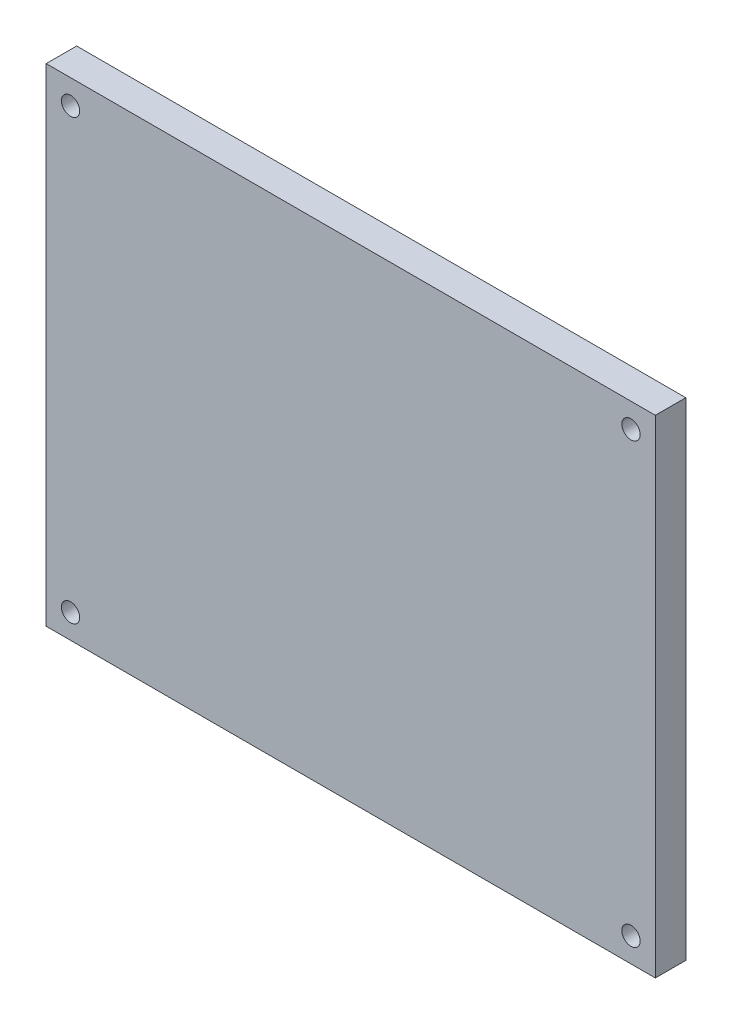
ISO-10303-21;
HEADER;
FILE_DESCRIPTION(('STEP AP214'),'2;1');
FILE_NAME('part.step','',(''),(''),'','','');
FILE_SCHEMA(('AUTOMOTIVE_DESIGN { 1 0 10303 214 1 1 1 1 }'));
ENDSEC;
DATA;
#1=APPLICATION_CONTEXT('core data for automotive mechanical design processes');
#2=APPLICATION_PROTOCOL_DEFINITION('international standard','automotive_design',2000,#1);
#3=PRODUCT_CONTEXT('',#1,'mechanical');
#4=PRODUCT('Part','Part','',(#3));
#5=PRODUCT_RELATED_PRODUCT_CATEGORY('part','',(#4));
#6=PRODUCT_DEFINITION_FORMATION('','',#4);
#7=PRODUCT_DEFINITION_CONTEXT('part definition',#1,'design');
#8=PRODUCT_DEFINITION('design','',#6,#7);
#9=PRODUCT_DEFINITION_SHAPE('','',#8);
#10=(LENGTH_UNIT() NAMED_UNIT(*) SI_UNIT(.MILLI.,.METRE.));
#11=(NAMED_UNIT(*) PLANE_ANGLE_UNIT() SI_UNIT($,.RADIAN.));
#12=(NAMED_UNIT(*) SI_UNIT($,.STERADIAN.) SOLID_ANGLE_UNIT());
#13=UNCERTAINTY_MEASURE_WITH_UNIT(LENGTH_MEASURE(1.E-05),#10,'distance_accuracy_value','');
#14=(GEOMETRIC_REPRESENTATION_CONTEXT(3) GLOBAL_UNCERTAINTY_ASSIGNED_CONTEXT((#13)) GLOBAL_UNIT_ASSIGNED_CONTEXT((#10,
#11,#12)) REPRESENTATION_CONTEXT('',''));
#15=CARTESIAN_POINT('',(0.,0.,0.));
#16=DIRECTION('',(0.,0.,1.));
#17=DIRECTION('',(1.,0.,0.));
#18=AXIS2_PLACEMENT_3D('',#15,#16,#17);
#19=CARTESIAN_POINT('',(0.,0.,5.));
#20=DIRECTION('',(0.,0.,1.));
#21=DIRECTION('',(1.,0.,0.));
#22=AXIS2_PLACEMENT_3D('',#19,#20,#21);
#23=PLANE('',#22);
#24=CARTESIAN_POINT('',(46.0000000000008,-36.,5.));
#25=DIRECTION('',(0.,0.,1.));
#26=DIRECTION('',(1.,0.,0.));
#27=AXIS2_PLACEMENT_3D('',#24,#25,#26);
#28=CIRCLE('',#27,1.5);
#29=CARTESIAN_POINT('',(47.5000000000008,-36.,5.));
#30=VERTEX_POINT('',#29);
#31=EDGE_CURVE('E125',#30,#30,#28,.T.);
#32=ORIENTED_EDGE('',*,*,#31,.F.);
#33=EDGE_LOOP('',(#32));
#34=FACE_BOUND('',#33,.T.);
#35=CARTESIAN_POINT('',(-46.,36.,5.));
#36=DIRECTION('',(0.,0.,1.));
#37=DIRECTION('',(1.,0.,0.));
#38=AXIS2_PLACEMENT_3D('',#35,#36,#37);
#39=CIRCLE('',#38,1.5);
#40=CARTESIAN_POINT('',(-44.5,36.,5.));
#41=VERTEX_POINT('',#40);
#42=EDGE_CURVE('E104',#41,#41,#39,.T.);
#43=ORIENTED_EDGE('',*,*,#42,.F.);
#44=EDGE_LOOP('',(#43));
#45=FACE_BOUND('',#44,.T.);
#46=DIRECTION('',(0.,-1.,0.));
#47=VECTOR('',#46,1.);
#48=CARTESIAN_POINT('',(-50.,-40.,5.));
#49=LINE('',#48,#47);
#50=CARTESIAN_POINT('',(-50.,40.,5.));
#51=VERTEX_POINT('',#50);
#52=CARTESIAN_POINT('',(-50.,-40.,5.));
#53=VERTEX_POINT('',#52);
#54=EDGE_CURVE('E89',#51,#53,#49,.T.);
#55=ORIENTED_EDGE('',*,*,#54,.T.);
#56=DIRECTION('',(1.,0.,0.));
#57=VECTOR('',#56,1.);
#58=CARTESIAN_POINT('',(50.,-40.,5.));
#59=LINE('',#58,#57);
#60=CARTESIAN_POINT('',(50.,-40.,5.));
#61=VERTEX_POINT('',#60);
#62=EDGE_CURVE('E84',#53,#61,#59,.T.);
#63=ORIENTED_EDGE('',*,*,#62,.T.);
#64=DIRECTION('',(0.,1.,0.));
#65=VECTOR('',#64,1.);
#66=CARTESIAN_POINT('',(50.,-40.,5.));
#67=LINE('',#66,#65);
#68=CARTESIAN_POINT('',(50.,40.,5.));
#69=VERTEX_POINT('',#68);
#70=EDGE_CURVE('E87',#61,#69,#67,.T.);
#71=ORIENTED_EDGE('',*,*,#70,.T.);
#72=DIRECTION('',(-1.,0.,0.));
#73=VECTOR('',#72,1.);
#74=CARTESIAN_POINT('',(50.,40.,5.));
#75=LINE('',#74,#73);
#76=EDGE_CURVE('E54',#69,#51,#75,.T.);
#77=ORIENTED_EDGE('',*,*,#76,.T.);
#78=EDGE_LOOP('',(#55,#63,#71,#77));
#79=FACE_BOUND('',#78,.T.);
#80=CARTESIAN_POINT('',(46.,36.,5.));
#81=DIRECTION('',(0.,0.,1.));
#82=DIRECTION('',(1.,0.,0.));
#83=AXIS2_PLACEMENT_3D('',#80,#81,#82);
#84=CIRCLE('',#83,1.5);
#85=CARTESIAN_POINT('',(47.5,36.,5.));
#86=VERTEX_POINT('',#85);
#87=EDGE_CURVE('E119',#86,#86,#84,.T.);
#88=ORIENTED_EDGE('',*,*,#87,.F.);
#89=EDGE_LOOP('',(#88));
#90=FACE_BOUND('',#89,.T.);
#91=CARTESIAN_POINT('',(-45.9999999999992,-36.,5.));
#92=DIRECTION('',(0.,0.,1.));
#93=DIRECTION('',(1.,0.,0.));
#94=AXIS2_PLACEMENT_3D('',#91,#92,#93);
#95=CIRCLE('',#94,1.5);
#96=CARTESIAN_POINT('',(-44.4999999999992,-36.,5.));
#97=VERTEX_POINT('',#96);
#98=EDGE_CURVE('E131',#97,#97,#95,.T.);
#99=ORIENTED_EDGE('',*,*,#98,.F.);
#100=EDGE_LOOP('',(#99));
#101=FACE_BOUND('',#100,.T.);
#102=ADVANCED_FACE('F37',(#34,#45,#79,#90,#101),#23,.T.);
#103=CARTESIAN_POINT('',(0.,0.,0.));
#104=DIRECTION('',(0.,0.,1.));
#105=DIRECTION('',(1.,0.,0.));
#106=AXIS2_PLACEMENT_3D('',#103,#104,#105);
#107=PLANE('',#106);
#108=DIRECTION('',(0.,-1.,0.));
#109=VECTOR('',#108,1.);
#110=CARTESIAN_POINT('',(-50.,-40.,0.));
#111=LINE('',#110,#109);
#112=CARTESIAN_POINT('',(-50.,40.,0.));
#113=VERTEX_POINT('',#112);
#114=CARTESIAN_POINT('',(-50.,-40.,0.));
#115=VERTEX_POINT('',#114);
#116=EDGE_CURVE('E101',#113,#115,#111,.T.);
#117=ORIENTED_EDGE('',*,*,#116,.F.);
#118=DIRECTION('',(-1.,0.,0.));
#119=VECTOR('',#118,1.);
#120=CARTESIAN_POINT('',(50.,40.,0.));
#121=LINE('',#120,#119);
#122=CARTESIAN_POINT('',(50.,40.,0.));
#123=VERTEX_POINT('',#122);
#124=EDGE_CURVE('E77',#123,#113,#121,.T.);
#125=ORIENTED_EDGE('',*,*,#124,.F.);
#126=DIRECTION('',(0.,1.,0.));
#127=VECTOR('',#126,1.);
#128=CARTESIAN_POINT('',(50.,-40.,0.));
#129=LINE('',#128,#127);
#130=CARTESIAN_POINT('',(50.,-40.,0.));
#131=VERTEX_POINT('',#130);
#132=EDGE_CURVE('E71',#131,#123,#129,.T.);
#133=ORIENTED_EDGE('',*,*,#132,.F.);
#134=DIRECTION('',(1.,0.,0.));
#135=VECTOR('',#134,1.);
#136=CARTESIAN_POINT('',(50.,-40.,0.));
#137=LINE('',#136,#135);
#138=EDGE_CURVE('E93',#115,#131,#137,.T.);
#139=ORIENTED_EDGE('',*,*,#138,.F.);
#140=EDGE_LOOP('',(#117,#125,#133,#139));
#141=FACE_BOUND('',#140,.T.);
#142=CARTESIAN_POINT('',(-46.,36.,0.));
#143=DIRECTION('',(0.,0.,1.));
#144=DIRECTION('',(1.,0.,0.));
#145=AXIS2_PLACEMENT_3D('',#142,#143,#144);
#146=CIRCLE('',#145,1.5);
#147=CARTESIAN_POINT('',(-44.5,36.,0.));
#148=VERTEX_POINT('',#147);
#149=EDGE_CURVE('E116',#148,#148,#146,.T.);
#150=ORIENTED_EDGE('',*,*,#149,.T.);
#151=EDGE_LOOP('',(#150));
#152=FACE_BOUND('',#151,.T.);
#153=CARTESIAN_POINT('',(46.,36.,0.));
#154=DIRECTION('',(0.,0.,1.));
#155=DIRECTION('',(1.,0.,0.));
#156=AXIS2_PLACEMENT_3D('',#153,#154,#155);
#157=CIRCLE('',#156,1.5);
#158=CARTESIAN_POINT('',(47.5,36.,0.));
#159=VERTEX_POINT('',#158);
#160=EDGE_CURVE('E122',#159,#159,#157,.T.);
#161=ORIENTED_EDGE('',*,*,#160,.T.);
#162=EDGE_LOOP('',(#161));
#163=FACE_BOUND('',#162,.T.);
#164=CARTESIAN_POINT('',(46.0000000000008,-36.,0.));
#165=DIRECTION('',(0.,0.,1.));
#166=DIRECTION('',(1.,0.,0.));
#167=AXIS2_PLACEMENT_3D('',#164,#165,#166);
#168=CIRCLE('',#167,1.5);
#169=CARTESIAN_POINT('',(47.5000000000008,-36.,0.));
#170=VERTEX_POINT('',#169);
#171=EDGE_CURVE('E128',#170,#170,#168,.T.);
#172=ORIENTED_EDGE('',*,*,#171,.T.);
#173=EDGE_LOOP('',(#172));
#174=FACE_BOUND('',#173,.T.);
#175=CARTESIAN_POINT('',(-45.9999999999992,-36.,0.));
#176=DIRECTION('',(0.,0.,1.));
#177=DIRECTION('',(1.,0.,0.));
#178=AXIS2_PLACEMENT_3D('',#175,#176,#177);
#179=CIRCLE('',#178,1.5);
#180=CARTESIAN_POINT('',(-44.4999999999992,-36.,0.));
#181=VERTEX_POINT('',#180);
#182=EDGE_CURVE('E134',#181,#181,#179,.T.);
#183=ORIENTED_EDGE('',*,*,#182,.T.);
#184=EDGE_LOOP('',(#183));
#185=FACE_BOUND('',#184,.T.);
#186=ADVANCED_FACE('F112',(#141,#152,#163,#174,#185),#107,.F.);
#187=CARTESIAN_POINT('',(-50.,-40.,5.));
#188=DIRECTION('',(1.,0.,0.));
#189=DIRECTION('',(0.,0.,-1.));
#190=AXIS2_PLACEMENT_3D('',#187,#188,#189);
#191=PLANE('',#190);
#192=ORIENTED_EDGE('',*,*,#116,.T.);
#193=DIRECTION('',(0.,0.,-1.));
#194=VECTOR('',#193,1.);
#195=CARTESIAN_POINT('',(-50.,-40.,5.));
#196=LINE('',#195,#194);
#197=EDGE_CURVE('E11',#53,#115,#196,.T.);
#198=ORIENTED_EDGE('',*,*,#197,.F.);
#199=ORIENTED_EDGE('',*,*,#54,.F.);
#200=DIRECTION('',(0.,0.,-1.));
#201=VECTOR('',#200,1.);
#202=CARTESIAN_POINT('',(-50.,40.,5.));
#203=LINE('',#202,#201);
#204=EDGE_CURVE('E97',#51,#113,#203,.T.);
#205=ORIENTED_EDGE('',*,*,#204,.T.);
#206=EDGE_LOOP('',(#192,#198,#199,#205));
#207=FACE_BOUND('',#206,.T.);
#208=ADVANCED_FACE('F39',(#207),#191,.F.);
#209=CARTESIAN_POINT('',(50.,-40.,5.));
#210=DIRECTION('',(0.,1.,0.));
#211=DIRECTION('',(-1.,0.,0.));
#212=AXIS2_PLACEMENT_3D('',#209,#210,#211);
#213=PLANE('',#212);
#214=ORIENTED_EDGE('',*,*,#138,.T.);
#215=DIRECTION('',(0.,0.,-1.));
#216=VECTOR('',#215,1.);
#217=CARTESIAN_POINT('',(50.,-40.,5.));
#218=LINE('',#217,#216);
#219=EDGE_CURVE('E46',#61,#131,#218,.T.);
#220=ORIENTED_EDGE('',*,*,#219,.F.);
#221=ORIENTED_EDGE('',*,*,#62,.F.);
#222=ORIENTED_EDGE('',*,*,#197,.T.);
#223=EDGE_LOOP('',(#214,#220,#221,#222));
#224=FACE_BOUND('',#223,.T.);
#225=ADVANCED_FACE('F92',(#224),#213,.F.);
#226=CARTESIAN_POINT('',(50.,-40.,5.));
#227=DIRECTION('',(-1.,0.,0.));
#228=DIRECTION('',(0.,0.,1.));
#229=AXIS2_PLACEMENT_3D('',#226,#227,#228);
#230=PLANE('',#229);
#231=ORIENTED_EDGE('',*,*,#132,.T.);
#232=DIRECTION('',(0.,0.,-1.));
#233=VECTOR('',#232,1.);
#234=CARTESIAN_POINT('',(50.,40.,5.));
#235=LINE('',#234,#233);
#236=EDGE_CURVE('E94',#69,#123,#235,.T.);
#237=ORIENTED_EDGE('',*,*,#236,.F.);
#238=ORIENTED_EDGE('',*,*,#70,.F.);
#239=ORIENTED_EDGE('',*,*,#219,.T.);
#240=EDGE_LOOP('',(#231,#237,#238,#239));
#241=FACE_BOUND('',#240,.T.);
#242=ADVANCED_FACE('F95',(#241),#230,.F.);
#243=CARTESIAN_POINT('',(50.,40.,5.));
#244=DIRECTION('',(0.,-1.,0.));
#245=DIRECTION('',(1.,0.,0.));
#246=AXIS2_PLACEMENT_3D('',#243,#244,#245);
#247=PLANE('',#246);
#248=ORIENTED_EDGE('',*,*,#124,.T.);
#249=ORIENTED_EDGE('',*,*,#204,.F.);
#250=ORIENTED_EDGE('',*,*,#76,.F.);
#251=ORIENTED_EDGE('',*,*,#236,.T.);
#252=EDGE_LOOP('',(#248,#249,#250,#251));
#253=FACE_BOUND('',#252,.T.);
#254=ADVANCED_FACE('F109',(#253),#247,.F.);
#255=CARTESIAN_POINT('',(-46.,36.,5.));
#256=DIRECTION('',(0.,0.,-1.));
#257=DIRECTION('',(-1.,0.,0.));
#258=AXIS2_PLACEMENT_3D('',#255,#256,#257);
#259=CYLINDRICAL_SURFACE('',#258,1.5);
#260=ORIENTED_EDGE('',*,*,#42,.T.);
#261=EDGE_LOOP('',(#260));
#262=FACE_BOUND('',#261,.T.);
#263=ORIENTED_EDGE('',*,*,#149,.F.);
#264=EDGE_LOOP('',(#263));
#265=FACE_BOUND('',#264,.T.);
#266=ADVANCED_FACE('F153',(#262,#265),#259,.F.);
#267=CARTESIAN_POINT('',(46.,36.,5.));
#268=DIRECTION('',(0.,0.,-1.));
#269=DIRECTION('',(-1.,0.,0.));
#270=AXIS2_PLACEMENT_3D('',#267,#268,#269);
#271=CYLINDRICAL_SURFACE('',#270,1.5);
#272=ORIENTED_EDGE('',*,*,#87,.T.);
#273=EDGE_LOOP('',(#272));
#274=FACE_BOUND('',#273,.T.);
#275=ORIENTED_EDGE('',*,*,#160,.F.);
#276=EDGE_LOOP('',(#275));
#277=FACE_BOUND('',#276,.T.);
#278=ADVANCED_FACE('F199',(#274,#277),#271,.F.);
#279=CARTESIAN_POINT('',(46.0000000000008,-36.,5.));
#280=DIRECTION('',(0.,0.,-1.));
#281=DIRECTION('',(-1.,0.,0.));
#282=AXIS2_PLACEMENT_3D('',#279,#280,#281);
#283=CYLINDRICAL_SURFACE('',#282,1.5);
#284=ORIENTED_EDGE('',*,*,#31,.T.);
#285=EDGE_LOOP('',(#284));
#286=FACE_BOUND('',#285,.T.);
#287=ORIENTED_EDGE('',*,*,#171,.F.);
#288=EDGE_LOOP('',(#287));
#289=FACE_BOUND('',#288,.T.);
#290=ADVANCED_FACE('F207',(#286,#289),#283,.F.);
#291=CARTESIAN_POINT('',(-45.9999999999992,-36.,5.));
#292=DIRECTION('',(0.,0.,-1.));
#293=DIRECTION('',(-1.,0.,0.));
#294=AXIS2_PLACEMENT_3D('',#291,#292,#293);
#295=CYLINDRICAL_SURFACE('',#294,1.5);
#296=ORIENTED_EDGE('',*,*,#98,.T.);
#297=EDGE_LOOP('',(#296));
#298=FACE_BOUND('',#297,.T.);
#299=ORIENTED_EDGE('',*,*,#182,.F.);
#300=EDGE_LOOP('',(#299));
#301=FACE_BOUND('',#300,.T.);
#302=ADVANCED_FACE('F140',(#298,#301),#295,.F.);
#303=CLOSED_SHELL('',(#102,#186,#208,#225,#242,#254,#266,#278,#290,#302));
#304=MANIFOLD_SOLID_BREP('B2',#303);
#305=ADVANCED_BREP_SHAPE_REPRESENTATION('',(#18,#304),#14);
#306=SHAPE_DEFINITION_REPRESENTATION(#9,#305);
ENDSEC;
END-ISO-10303-21;
